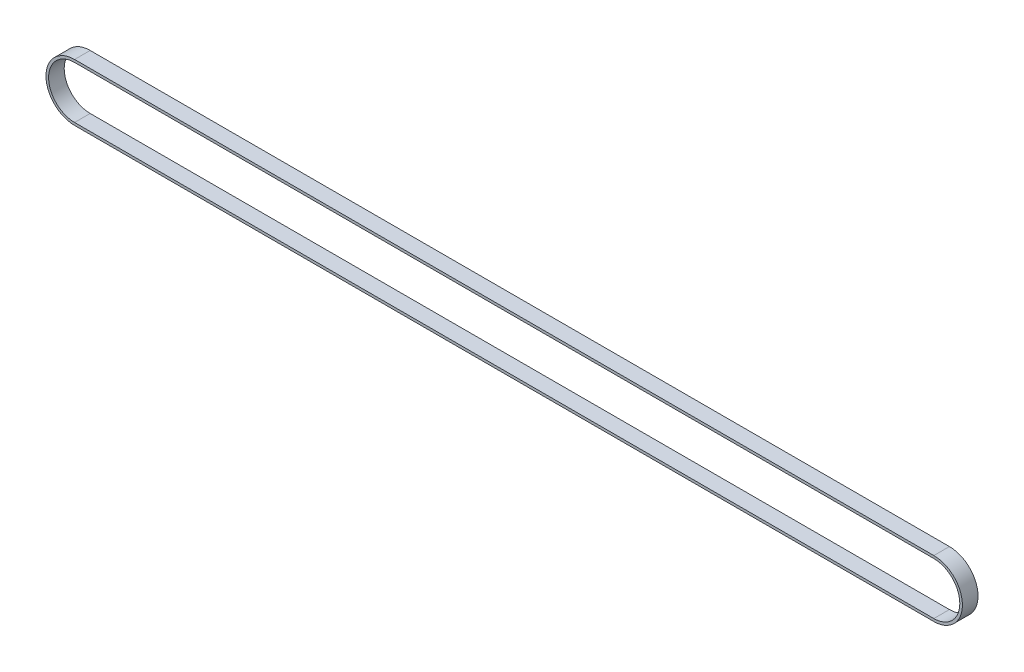
ISO-10303-21;
HEADER;
FILE_DESCRIPTION(('STEP AP214'),'2;1');
FILE_NAME('part.step','',(''),(''),'','','');
FILE_SCHEMA(('AUTOMOTIVE_DESIGN { 1 0 10303 214 1 1 1 1 }'));
ENDSEC;
DATA;
#1=APPLICATION_CONTEXT('core data for automotive mechanical design processes');
#2=APPLICATION_PROTOCOL_DEFINITION('international standard','automotive_design',2000,#1);
#3=PRODUCT_CONTEXT('',#1,'mechanical');
#4=PRODUCT('Part','Part','',(#3));
#5=PRODUCT_RELATED_PRODUCT_CATEGORY('part','',(#4));
#6=PRODUCT_DEFINITION_FORMATION('','',#4);
#7=PRODUCT_DEFINITION_CONTEXT('part definition',#1,'design');
#8=PRODUCT_DEFINITION('design','',#6,#7);
#9=PRODUCT_DEFINITION_SHAPE('','',#8);
#10=(LENGTH_UNIT() NAMED_UNIT(*) SI_UNIT(.MILLI.,.METRE.));
#11=(NAMED_UNIT(*) PLANE_ANGLE_UNIT() SI_UNIT($,.RADIAN.));
#12=(NAMED_UNIT(*) SI_UNIT($,.STERADIAN.) SOLID_ANGLE_UNIT());
#13=UNCERTAINTY_MEASURE_WITH_UNIT(LENGTH_MEASURE(1.E-05),#10,'distance_accuracy_value','');
#14=(GEOMETRIC_REPRESENTATION_CONTEXT(3) GLOBAL_UNCERTAINTY_ASSIGNED_CONTEXT((#13)) GLOBAL_UNIT_ASSIGNED_CONTEXT((#10,
#11,#12)) REPRESENTATION_CONTEXT('',''));
#15=CARTESIAN_POINT('',(0.,0.,0.));
#16=DIRECTION('',(0.,0.,1.));
#17=DIRECTION('',(1.,0.,0.));
#18=AXIS2_PLACEMENT_3D('',#15,#16,#17);
#19=CARTESIAN_POINT('',(0.,0.,6.));
#20=DIRECTION('',(0.,0.,1.));
#21=DIRECTION('',(1.,0.,0.));
#22=AXIS2_PLACEMENT_3D('',#19,#20,#21);
#23=PLANE('',#22);
#24=CARTESIAN_POINT('',(0.,0.,6.));
#25=DIRECTION('',(0.,0.,1.));
#26=DIRECTION('',(1.,0.,0.));
#27=AXIS2_PLACEMENT_3D('',#24,#25,#26);
#28=CIRCLE('',#27,11.);
#29=CARTESIAN_POINT('',(0.,11.,6.));
#30=VERTEX_POINT('',#29);
#31=CARTESIAN_POINT('',(0.,-11.,6.));
#32=VERTEX_POINT('',#31);
#33=EDGE_CURVE('E134',#30,#32,#28,.T.);
#34=ORIENTED_EDGE('',*,*,#33,.T.);
#35=DIRECTION('',(1.,0.,0.));
#36=VECTOR('',#35,1.);
#37=CARTESIAN_POINT('',(0.,-11.,6.));
#38=LINE('',#37,#36);
#39=CARTESIAN_POINT('',(330.7,-11.,6.));
#40=VERTEX_POINT('',#39);
#41=EDGE_CURVE('E137',#32,#40,#38,.T.);
#42=ORIENTED_EDGE('',*,*,#41,.T.);
#43=CARTESIAN_POINT('',(330.7,0.,6.));
#44=DIRECTION('',(0.,0.,1.));
#45=DIRECTION('',(1.,0.,0.));
#46=AXIS2_PLACEMENT_3D('',#43,#44,#45);
#47=CIRCLE('',#46,11.);
#48=CARTESIAN_POINT('',(330.7,11.,6.));
#49=VERTEX_POINT('',#48);
#50=EDGE_CURVE('E140',#40,#49,#47,.T.);
#51=ORIENTED_EDGE('',*,*,#50,.T.);
#52=DIRECTION('',(-1.,0.,0.));
#53=VECTOR('',#52,1.);
#54=CARTESIAN_POINT('',(0.,11.,6.));
#55=LINE('',#54,#53);
#56=EDGE_CURVE('E142',#49,#30,#55,.T.);
#57=ORIENTED_EDGE('',*,*,#56,.T.);
#58=EDGE_LOOP('',(#34,#42,#51,#57));
#59=FACE_BOUND('',#58,.T.);
#60=DIRECTION('',(1.,0.,0.));
#61=VECTOR('',#60,1.);
#62=CARTESIAN_POINT('',(0.,-10.,6.));
#63=LINE('',#62,#61);
#64=CARTESIAN_POINT('',(0.,-10.,6.));
#65=VERTEX_POINT('',#64);
#66=CARTESIAN_POINT('',(330.7,-10.,6.));
#67=VERTEX_POINT('',#66);
#68=EDGE_CURVE('E106',#65,#67,#63,.T.);
#69=ORIENTED_EDGE('',*,*,#68,.F.);
#70=CARTESIAN_POINT('',(0.,0.,6.));
#71=DIRECTION('',(0.,0.,1.));
#72=DIRECTION('',(1.,0.,0.));
#73=AXIS2_PLACEMENT_3D('',#70,#71,#72);
#74=CIRCLE('',#73,10.);
#75=CARTESIAN_POINT('',(0.,10.,6.));
#76=VERTEX_POINT('',#75);
#77=EDGE_CURVE('E98',#76,#65,#74,.T.);
#78=ORIENTED_EDGE('',*,*,#77,.F.);
#79=DIRECTION('',(-1.,0.,0.));
#80=VECTOR('',#79,1.);
#81=CARTESIAN_POINT('',(0.,10.,6.));
#82=LINE('',#81,#80);
#83=CARTESIAN_POINT('',(330.7,10.,6.));
#84=VERTEX_POINT('',#83);
#85=EDGE_CURVE('E120',#84,#76,#82,.T.);
#86=ORIENTED_EDGE('',*,*,#85,.F.);
#87=CARTESIAN_POINT('',(330.7,0.,6.));
#88=DIRECTION('',(0.,0.,1.));
#89=DIRECTION('',(1.,0.,0.));
#90=AXIS2_PLACEMENT_3D('',#87,#88,#89);
#91=CIRCLE('',#90,10.);
#92=EDGE_CURVE('E118',#67,#84,#91,.T.);
#93=ORIENTED_EDGE('',*,*,#92,.F.);
#94=EDGE_LOOP('',(#69,#78,#86,#93));
#95=FACE_BOUND('',#94,.T.);
#96=ADVANCED_FACE('F33',(#59,#95),#23,.T.);
#97=CARTESIAN_POINT('',(0.,0.,0.));
#98=DIRECTION('',(0.,0.,1.));
#99=DIRECTION('',(1.,0.,0.));
#100=AXIS2_PLACEMENT_3D('',#97,#98,#99);
#101=PLANE('',#100);
#102=CARTESIAN_POINT('',(0.,0.,0.));
#103=DIRECTION('',(0.,0.,1.));
#104=DIRECTION('',(1.,0.,0.));
#105=AXIS2_PLACEMENT_3D('',#102,#103,#104);
#106=CIRCLE('',#105,11.);
#107=CARTESIAN_POINT('',(0.,11.,0.));
#108=VERTEX_POINT('',#107);
#109=CARTESIAN_POINT('',(0.,-11.,0.));
#110=VERTEX_POINT('',#109);
#111=EDGE_CURVE('E114',#108,#110,#106,.T.);
#112=ORIENTED_EDGE('',*,*,#111,.F.);
#113=DIRECTION('',(-1.,0.,0.));
#114=VECTOR('',#113,1.);
#115=CARTESIAN_POINT('',(0.,11.,0.));
#116=LINE('',#115,#114);
#117=CARTESIAN_POINT('',(330.7,11.,0.));
#118=VERTEX_POINT('',#117);
#119=EDGE_CURVE('E138',#118,#108,#116,.T.);
#120=ORIENTED_EDGE('',*,*,#119,.F.);
#121=CARTESIAN_POINT('',(330.7,0.,0.));
#122=DIRECTION('',(0.,0.,1.));
#123=DIRECTION('',(1.,0.,0.));
#124=AXIS2_PLACEMENT_3D('',#121,#122,#123);
#125=CIRCLE('',#124,11.);
#126=CARTESIAN_POINT('',(330.7,-11.,0.));
#127=VERTEX_POINT('',#126);
#128=EDGE_CURVE('E149',#127,#118,#125,.T.);
#129=ORIENTED_EDGE('',*,*,#128,.F.);
#130=DIRECTION('',(1.,0.,0.));
#131=VECTOR('',#130,1.);
#132=CARTESIAN_POINT('',(0.,-11.,0.));
#133=LINE('',#132,#131);
#134=EDGE_CURVE('E147',#110,#127,#133,.T.);
#135=ORIENTED_EDGE('',*,*,#134,.F.);
#136=EDGE_LOOP('',(#112,#120,#129,#135));
#137=FACE_BOUND('',#136,.T.);
#138=CARTESIAN_POINT('',(0.,0.,0.));
#139=DIRECTION('',(0.,0.,1.));
#140=DIRECTION('',(1.,0.,0.));
#141=AXIS2_PLACEMENT_3D('',#138,#139,#140);
#142=CIRCLE('',#141,10.);
#143=CARTESIAN_POINT('',(0.,10.,0.));
#144=VERTEX_POINT('',#143);
#145=CARTESIAN_POINT('',(0.,-10.,0.));
#146=VERTEX_POINT('',#145);
#147=EDGE_CURVE('E56',#144,#146,#142,.T.);
#148=ORIENTED_EDGE('',*,*,#147,.T.);
#149=DIRECTION('',(1.,0.,0.));
#150=VECTOR('',#149,1.);
#151=CARTESIAN_POINT('',(0.,-10.,0.));
#152=LINE('',#151,#150);
#153=CARTESIAN_POINT('',(330.7,-10.,0.));
#154=VERTEX_POINT('',#153);
#155=EDGE_CURVE('E113',#146,#154,#152,.T.);
#156=ORIENTED_EDGE('',*,*,#155,.T.);
#157=CARTESIAN_POINT('',(330.7,0.,0.));
#158=DIRECTION('',(0.,0.,1.));
#159=DIRECTION('',(1.,0.,0.));
#160=AXIS2_PLACEMENT_3D('',#157,#158,#159);
#161=CIRCLE('',#160,10.);
#162=CARTESIAN_POINT('',(330.7,10.,0.));
#163=VERTEX_POINT('',#162);
#164=EDGE_CURVE('E126',#154,#163,#161,.T.);
#165=ORIENTED_EDGE('',*,*,#164,.T.);
#166=DIRECTION('',(-1.,0.,0.));
#167=VECTOR('',#166,1.);
#168=CARTESIAN_POINT('',(0.,10.,0.));
#169=LINE('',#168,#167);
#170=EDGE_CURVE('E107',#163,#144,#169,.T.);
#171=ORIENTED_EDGE('',*,*,#170,.T.);
#172=EDGE_LOOP('',(#148,#156,#165,#171));
#173=FACE_BOUND('',#172,.T.);
#174=ADVANCED_FACE('F167',(#137,#173),#101,.F.);
#175=CARTESIAN_POINT('',(0.,0.,6.));
#176=DIRECTION('',(0.,0.,-1.));
#177=DIRECTION('',(-1.,0.,0.));
#178=AXIS2_PLACEMENT_3D('',#175,#176,#177);
#179=CYLINDRICAL_SURFACE('',#178,11.);
#180=ORIENTED_EDGE('',*,*,#111,.T.);
#181=DIRECTION('',(0.,0.,-1.));
#182=VECTOR('',#181,1.);
#183=CARTESIAN_POINT('',(0.,-11.,6.));
#184=LINE('',#183,#182);
#185=EDGE_CURVE('E11',#32,#110,#184,.T.);
#186=ORIENTED_EDGE('',*,*,#185,.F.);
#187=ORIENTED_EDGE('',*,*,#33,.F.);
#188=DIRECTION('',(0.,0.,-1.));
#189=VECTOR('',#188,1.);
#190=CARTESIAN_POINT('',(0.,11.,6.));
#191=LINE('',#190,#189);
#192=EDGE_CURVE('E144',#30,#108,#191,.T.);
#193=ORIENTED_EDGE('',*,*,#192,.T.);
#194=EDGE_LOOP('',(#180,#186,#187,#193));
#195=FACE_BOUND('',#194,.T.);
#196=ADVANCED_FACE('F35',(#195),#179,.T.);
#197=CARTESIAN_POINT('',(0.,-11.,6.));
#198=DIRECTION('',(0.,1.,0.));
#199=DIRECTION('',(0.,0.,1.));
#200=AXIS2_PLACEMENT_3D('',#197,#198,#199);
#201=PLANE('',#200);
#202=ORIENTED_EDGE('',*,*,#134,.T.);
#203=DIRECTION('',(0.,0.,-1.));
#204=VECTOR('',#203,1.);
#205=CARTESIAN_POINT('',(330.7,-11.,6.));
#206=LINE('',#205,#204);
#207=EDGE_CURVE('E41',#40,#127,#206,.T.);
#208=ORIENTED_EDGE('',*,*,#207,.F.);
#209=ORIENTED_EDGE('',*,*,#41,.F.);
#210=ORIENTED_EDGE('',*,*,#185,.T.);
#211=EDGE_LOOP('',(#202,#208,#209,#210));
#212=FACE_BOUND('',#211,.T.);
#213=ADVANCED_FACE('F177',(#212),#201,.F.);
#214=CARTESIAN_POINT('',(330.7,0.,6.));
#215=DIRECTION('',(0.,0.,-1.));
#216=DIRECTION('',(-1.,0.,0.));
#217=AXIS2_PLACEMENT_3D('',#214,#215,#216);
#218=CYLINDRICAL_SURFACE('',#217,11.);
#219=ORIENTED_EDGE('',*,*,#128,.T.);
#220=DIRECTION('',(0.,0.,-1.));
#221=VECTOR('',#220,1.);
#222=CARTESIAN_POINT('',(330.7,11.,6.));
#223=LINE('',#222,#221);
#224=EDGE_CURVE('E154',#49,#118,#223,.T.);
#225=ORIENTED_EDGE('',*,*,#224,.F.);
#226=ORIENTED_EDGE('',*,*,#50,.F.);
#227=ORIENTED_EDGE('',*,*,#207,.T.);
#228=EDGE_LOOP('',(#219,#225,#226,#227));
#229=FACE_BOUND('',#228,.T.);
#230=ADVANCED_FACE('F161',(#229),#218,.T.);
#231=CARTESIAN_POINT('',(0.,11.,6.));
#232=DIRECTION('',(0.,-1.,0.));
#233=DIRECTION('',(0.,0.,-1.));
#234=AXIS2_PLACEMENT_3D('',#231,#232,#233);
#235=PLANE('',#234);
#236=ORIENTED_EDGE('',*,*,#119,.T.);
#237=ORIENTED_EDGE('',*,*,#192,.F.);
#238=ORIENTED_EDGE('',*,*,#56,.F.);
#239=ORIENTED_EDGE('',*,*,#224,.T.);
#240=EDGE_LOOP('',(#236,#237,#238,#239));
#241=FACE_BOUND('',#240,.T.);
#242=ADVANCED_FACE('F171',(#241),#235,.F.);
#243=CARTESIAN_POINT('',(0.,0.,6.));
#244=DIRECTION('',(0.,0.,-1.));
#245=DIRECTION('',(-1.,0.,0.));
#246=AXIS2_PLACEMENT_3D('',#243,#244,#245);
#247=CYLINDRICAL_SURFACE('',#246,10.);
#248=ORIENTED_EDGE('',*,*,#147,.F.);
#249=DIRECTION('',(0.,0.,-1.));
#250=VECTOR('',#249,1.);
#251=CARTESIAN_POINT('',(0.,10.,6.));
#252=LINE('',#251,#250);
#253=EDGE_CURVE('E102',#76,#144,#252,.T.);
#254=ORIENTED_EDGE('',*,*,#253,.F.);
#255=ORIENTED_EDGE('',*,*,#77,.T.);
#256=DIRECTION('',(0.,0.,-1.));
#257=VECTOR('',#256,1.);
#258=CARTESIAN_POINT('',(0.,-10.,6.));
#259=LINE('',#258,#257);
#260=EDGE_CURVE('E101',#65,#146,#259,.T.);
#261=ORIENTED_EDGE('',*,*,#260,.T.);
#262=EDGE_LOOP('',(#248,#254,#255,#261));
#263=FACE_BOUND('',#262,.T.);
#264=ADVANCED_FACE('F100',(#263),#247,.F.);
#265=CARTESIAN_POINT('',(0.,-10.,6.));
#266=DIRECTION('',(0.,1.,0.));
#267=DIRECTION('',(0.,0.,1.));
#268=AXIS2_PLACEMENT_3D('',#265,#266,#267);
#269=PLANE('',#268);
#270=ORIENTED_EDGE('',*,*,#155,.F.);
#271=ORIENTED_EDGE('',*,*,#260,.F.);
#272=ORIENTED_EDGE('',*,*,#68,.T.);
#273=DIRECTION('',(0.,0.,-1.));
#274=VECTOR('',#273,1.);
#275=CARTESIAN_POINT('',(330.7,-10.,6.));
#276=LINE('',#275,#274);
#277=EDGE_CURVE('E115',#67,#154,#276,.T.);
#278=ORIENTED_EDGE('',*,*,#277,.T.);
#279=EDGE_LOOP('',(#270,#271,#272,#278));
#280=FACE_BOUND('',#279,.T.);
#281=ADVANCED_FACE('F110',(#280),#269,.T.);
#282=CARTESIAN_POINT('',(330.7,0.,6.));
#283=DIRECTION('',(0.,0.,-1.));
#284=DIRECTION('',(-1.,0.,0.));
#285=AXIS2_PLACEMENT_3D('',#282,#283,#284);
#286=CYLINDRICAL_SURFACE('',#285,10.);
#287=ORIENTED_EDGE('',*,*,#164,.F.);
#288=ORIENTED_EDGE('',*,*,#277,.F.);
#289=ORIENTED_EDGE('',*,*,#92,.T.);
#290=DIRECTION('',(0.,0.,-1.));
#291=VECTOR('',#290,1.);
#292=CARTESIAN_POINT('',(330.7,10.,6.));
#293=LINE('',#292,#291);
#294=EDGE_CURVE('E48',#84,#163,#293,.T.);
#295=ORIENTED_EDGE('',*,*,#294,.T.);
#296=EDGE_LOOP('',(#287,#288,#289,#295));
#297=FACE_BOUND('',#296,.T.);
#298=ADVANCED_FACE('F200',(#297),#286,.F.);
#299=CARTESIAN_POINT('',(0.,10.,6.));
#300=DIRECTION('',(0.,-1.,0.));
#301=DIRECTION('',(0.,0.,-1.));
#302=AXIS2_PLACEMENT_3D('',#299,#300,#301);
#303=PLANE('',#302);
#304=ORIENTED_EDGE('',*,*,#170,.F.);
#305=ORIENTED_EDGE('',*,*,#294,.F.);
#306=ORIENTED_EDGE('',*,*,#85,.T.);
#307=ORIENTED_EDGE('',*,*,#253,.T.);
#308=EDGE_LOOP('',(#304,#305,#306,#307));
#309=FACE_BOUND('',#308,.T.);
#310=ADVANCED_FACE('F204',(#309),#303,.T.);
#311=CLOSED_SHELL('',(#96,#174,#196,#213,#230,#242,#264,#281,#298,#310));
#312=MANIFOLD_SOLID_BREP('B2',#311);
#313=ADVANCED_BREP_SHAPE_REPRESENTATION('',(#18,#312),#14);
#314=SHAPE_DEFINITION_REPRESENTATION(#9,#313);
ENDSEC;
END-ISO-10303-21;
